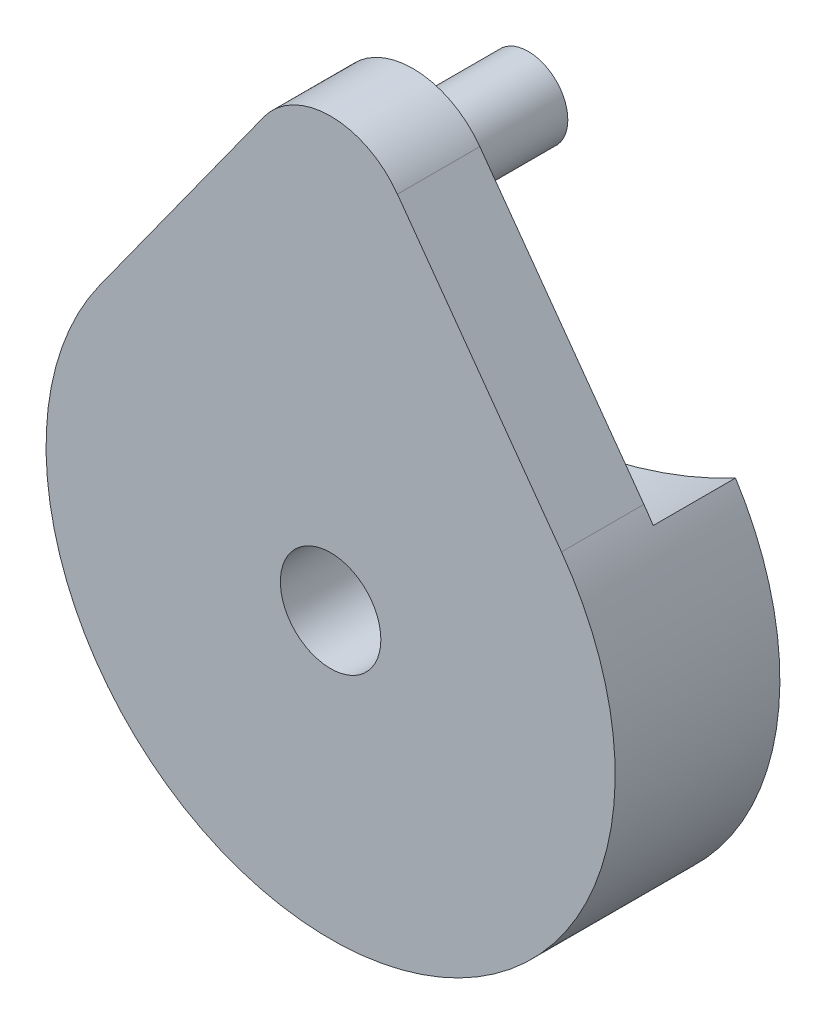
ISO-10303-21;
HEADER;
FILE_DESCRIPTION(('STEP AP214'),'2;1');
FILE_NAME('part.step','',(''),(''),'','','');
FILE_SCHEMA(('AUTOMOTIVE_DESIGN { 1 0 10303 214 1 1 1 1 }'));
ENDSEC;
DATA;
#1=APPLICATION_CONTEXT('core data for automotive mechanical design processes');
#2=APPLICATION_PROTOCOL_DEFINITION('international standard','automotive_design',2000,#1);
#3=PRODUCT_CONTEXT('',#1,'mechanical');
#4=PRODUCT('Part','Part','',(#3));
#5=PRODUCT_RELATED_PRODUCT_CATEGORY('part','',(#4));
#6=PRODUCT_DEFINITION_FORMATION('','',#4);
#7=PRODUCT_DEFINITION_CONTEXT('part definition',#1,'design');
#8=PRODUCT_DEFINITION('design','',#6,#7);
#9=PRODUCT_DEFINITION_SHAPE('','',#8);
#10=(LENGTH_UNIT() NAMED_UNIT(*) SI_UNIT(.MILLI.,.METRE.));
#11=(NAMED_UNIT(*) PLANE_ANGLE_UNIT() SI_UNIT($,.RADIAN.));
#12=(NAMED_UNIT(*) SI_UNIT($,.STERADIAN.) SOLID_ANGLE_UNIT());
#13=UNCERTAINTY_MEASURE_WITH_UNIT(LENGTH_MEASURE(1.E-05),#10,'distance_accuracy_value','');
#14=(GEOMETRIC_REPRESENTATION_CONTEXT(3) GLOBAL_UNCERTAINTY_ASSIGNED_CONTEXT((#13)) GLOBAL_UNIT_ASSIGNED_CONTEXT((#10,
#11,#12)) REPRESENTATION_CONTEXT('',''));
#15=CARTESIAN_POINT('',(0.,0.,0.));
#16=DIRECTION('',(0.,0.,1.));
#17=DIRECTION('',(1.,0.,0.));
#18=AXIS2_PLACEMENT_3D('',#15,#16,#17);
#19=CARTESIAN_POINT('',(0.,-36.6196668472011,-2.5));
#20=DIRECTION('',(0.,0.,1.));
#21=DIRECTION('',(1.,0.,0.));
#22=AXIS2_PLACEMENT_3D('',#19,#20,#21);
#23=PLANE('',#22);
#24=CARTESIAN_POINT('',(0.,-15.6196668472011,-2.5));
#25=DIRECTION('',(0.,0.,1.));
#26=DIRECTION('',(1.,0.,0.));
#27=AXIS2_PLACEMENT_3D('',#24,#25,#26);
#28=CIRCLE('',#27,2.4);
#29=CARTESIAN_POINT('',(2.4,-15.6196668472011,-2.5));
#30=VERTEX_POINT('',#29);
#31=EDGE_CURVE('E11',#30,#30,#28,.F.);
#32=ORIENTED_EDGE('',*,*,#31,.F.);
#33=EDGE_LOOP('',(#32));
#34=FACE_BOUND('',#33,.T.);
#35=CARTESIAN_POINT('',(0.,0.,-2.5));
#36=DIRECTION('',(0.,0.,1.));
#37=DIRECTION('',(-1.,0.,0.));
#38=AXIS2_PLACEMENT_3D('',#35,#36,#37);
#39=CIRCLE('',#38,31.);
#40=CARTESIAN_POINT('',(-14.5799521902476,-27.357357221232,-2.5));
#41=VERTEX_POINT('',#40);
#42=CARTESIAN_POINT('',(14.5799521902476,-27.357357221232,-2.5));
#43=VERTEX_POINT('',#42);
#44=EDGE_CURVE('E49',#41,#43,#39,.T.);
#45=ORIENTED_EDGE('',*,*,#44,.F.);
#46=CARTESIAN_POINT('',(0.,-36.6196668472011,-2.5));
#47=DIRECTION('',(0.,0.,1.));
#48=DIRECTION('',(1.,0.,0.));
#49=AXIS2_PLACEMENT_3D('',#46,#47,#48);
#50=CIRCLE('',#49,17.2732563657588);
#51=CARTESIAN_POINT('',(-14.0161483680143,-26.5244714353709,-2.5));
#52=VERTEX_POINT('',#51);
#53=EDGE_CURVE('E114',#52,#41,#50,.T.);
#54=ORIENTED_EDGE('',*,*,#53,.F.);
#55=DIRECTION('',(-0.584440779321849,-0.811436365629289,0.));
#56=VECTOR('',#55,1.);
#57=CARTESIAN_POINT('',(-14.0161483680143,-26.5244714353709,-2.5));
#58=LINE('',#57,#56);
#59=CARTESIAN_POINT('',(-4.05718182814645,-12.6974629505919,-2.5));
#60=VERTEX_POINT('',#59);
#61=EDGE_CURVE('E79',#60,#52,#58,.T.);
#62=ORIENTED_EDGE('',*,*,#61,.F.);
#63=CARTESIAN_POINT('',(0.,-15.6196668472011,-2.5));
#64=DIRECTION('',(0.,0.,1.));
#65=DIRECTION('',(1.,0.,0.));
#66=AXIS2_PLACEMENT_3D('',#63,#64,#65);
#67=CIRCLE('',#66,5.);
#68=CARTESIAN_POINT('',(4.05718182814645,-12.6974629505919,-2.5));
#69=VERTEX_POINT('',#68);
#70=EDGE_CURVE('E146',#69,#60,#67,.T.);
#71=ORIENTED_EDGE('',*,*,#70,.F.);
#72=DIRECTION('',(-0.584440779321849,0.81143636562929,0.));
#73=VECTOR('',#72,1.);
#74=CARTESIAN_POINT('',(14.0161483680143,-26.5244714353709,-2.5));
#75=LINE('',#74,#73);
#76=CARTESIAN_POINT('',(14.0161483680143,-26.5244714353709,-2.5));
#77=VERTEX_POINT('',#76);
#78=EDGE_CURVE('E135',#77,#69,#75,.T.);
#79=ORIENTED_EDGE('',*,*,#78,.F.);
#80=EDGE_CURVE('E112',#43,#77,#50,.T.);
#81=ORIENTED_EDGE('',*,*,#80,.F.);
#82=EDGE_LOOP('',(#45,#54,#62,#71,#79,#81));
#83=FACE_BOUND('',#82,.T.);
#84=ADVANCED_FACE('F34',(#34,#83),#23,.F.);
#85=CARTESIAN_POINT('',(0.,-36.6196668472011,2.5));
#86=DIRECTION('',(0.,0.,-1.));
#87=DIRECTION('',(-1.,0.,0.));
#88=AXIS2_PLACEMENT_3D('',#85,#86,#87);
#89=CYLINDRICAL_SURFACE('',#88,17.2732563657588);
#90=ORIENTED_EDGE('',*,*,#53,.T.);
#91=DIRECTION('',(0.,0.,1.));
#92=VECTOR('',#91,1.);
#93=CARTESIAN_POINT('',(-14.5799521902476,-27.357357221232,-7.5));
#94=LINE('',#93,#92);
#95=CARTESIAN_POINT('',(-14.5799521902476,-27.357357221232,-7.5));
#96=VERTEX_POINT('',#95);
#97=EDGE_CURVE('E103',#96,#41,#94,.T.);
#98=ORIENTED_EDGE('',*,*,#97,.F.);
#99=CARTESIAN_POINT('',(0.,-36.6196668472011,-7.5));
#100=DIRECTION('',(0.,0.,-1.));
#101=DIRECTION('',(-1.,0.,0.));
#102=AXIS2_PLACEMENT_3D('',#99,#100,#101);
#103=CIRCLE('',#102,17.2732563657588);
#104=CARTESIAN_POINT('',(14.5799521902476,-27.357357221232,-7.5));
#105=VERTEX_POINT('',#104);
#106=EDGE_CURVE('E98',#105,#96,#103,.T.);
#107=ORIENTED_EDGE('',*,*,#106,.F.);
#108=DIRECTION('',(0.,0.,1.));
#109=VECTOR('',#108,1.);
#110=CARTESIAN_POINT('',(14.5799521902476,-27.357357221232,-7.5));
#111=LINE('',#110,#109);
#112=EDGE_CURVE('E101',#105,#43,#111,.T.);
#113=ORIENTED_EDGE('',*,*,#112,.T.);
#114=ORIENTED_EDGE('',*,*,#80,.T.);
#115=DIRECTION('',(0.,0.,-1.));
#116=VECTOR('',#115,1.);
#117=CARTESIAN_POINT('',(14.0161483680143,-26.5244714353709,2.5));
#118=LINE('',#117,#116);
#119=CARTESIAN_POINT('',(14.0161483680143,-26.5244714353709,2.5));
#120=VERTEX_POINT('',#119);
#121=EDGE_CURVE('E42',#120,#77,#118,.T.);
#122=ORIENTED_EDGE('',*,*,#121,.F.);
#123=CARTESIAN_POINT('',(0.,-36.6196668472011,2.5));
#124=DIRECTION('',(0.,0.,1.));
#125=DIRECTION('',(1.,0.,0.));
#126=AXIS2_PLACEMENT_3D('',#123,#124,#125);
#127=CIRCLE('',#126,17.2732563657588);
#128=CARTESIAN_POINT('',(-14.0161483680143,-26.5244714353709,2.5));
#129=VERTEX_POINT('',#128);
#130=EDGE_CURVE('E127',#129,#120,#127,.T.);
#131=ORIENTED_EDGE('',*,*,#130,.F.);
#132=DIRECTION('',(0.,0.,-1.));
#133=VECTOR('',#132,1.);
#134=CARTESIAN_POINT('',(-14.0161483680143,-26.5244714353709,2.5));
#135=LINE('',#134,#133);
#136=EDGE_CURVE('E132',#129,#52,#135,.T.);
#137=ORIENTED_EDGE('',*,*,#136,.T.);
#138=EDGE_LOOP('',(#90,#98,#107,#113,#114,#122,#131,#137));
#139=FACE_BOUND('',#138,.T.);
#140=ADVANCED_FACE('F36',(#139),#89,.T.);
#141=CARTESIAN_POINT('',(14.0161483680143,-26.5244714353709,2.5));
#142=DIRECTION('',(-0.81143636562929,-0.584440779321849,0.));
#143=DIRECTION('',(0.584440779321849,-0.81143636562929,0.));
#144=AXIS2_PLACEMENT_3D('',#141,#142,#143);
#145=PLANE('',#144);
#146=ORIENTED_EDGE('',*,*,#78,.T.);
#147=DIRECTION('',(0.,0.,-1.));
#148=VECTOR('',#147,1.);
#149=CARTESIAN_POINT('',(4.05718182814645,-12.6974629505919,2.5));
#150=LINE('',#149,#148);
#151=CARTESIAN_POINT('',(4.05718182814645,-12.6974629505919,2.5));
#152=VERTEX_POINT('',#151);
#153=EDGE_CURVE('E140',#152,#69,#150,.T.);
#154=ORIENTED_EDGE('',*,*,#153,.F.);
#155=DIRECTION('',(-0.584440779321849,0.81143636562929,0.));
#156=VECTOR('',#155,1.);
#157=CARTESIAN_POINT('',(14.0161483680143,-26.5244714353709,2.5));
#158=LINE('',#157,#156);
#159=EDGE_CURVE('E87',#120,#152,#158,.T.);
#160=ORIENTED_EDGE('',*,*,#159,.F.);
#161=ORIENTED_EDGE('',*,*,#121,.T.);
#162=EDGE_LOOP('',(#146,#154,#160,#161));
#163=FACE_BOUND('',#162,.T.);
#164=ADVANCED_FACE('F151',(#163),#145,.F.);
#165=CARTESIAN_POINT('',(0.,-15.6196668472011,2.5));
#166=DIRECTION('',(0.,0.,-1.));
#167=DIRECTION('',(-1.,0.,0.));
#168=AXIS2_PLACEMENT_3D('',#165,#166,#167);
#169=CYLINDRICAL_SURFACE('',#168,5.);
#170=ORIENTED_EDGE('',*,*,#70,.T.);
#171=DIRECTION('',(0.,0.,-1.));
#172=VECTOR('',#171,1.);
#173=CARTESIAN_POINT('',(-4.05718182814645,-12.6974629505919,2.5));
#174=LINE('',#173,#172);
#175=CARTESIAN_POINT('',(-4.05718182814645,-12.6974629505919,2.5));
#176=VERTEX_POINT('',#175);
#177=EDGE_CURVE('E143',#176,#60,#174,.T.);
#178=ORIENTED_EDGE('',*,*,#177,.F.);
#179=CARTESIAN_POINT('',(0.,-15.6196668472011,2.5));
#180=DIRECTION('',(0.,0.,1.));
#181=DIRECTION('',(1.,0.,0.));
#182=AXIS2_PLACEMENT_3D('',#179,#180,#181);
#183=CIRCLE('',#182,5.);
#184=EDGE_CURVE('E130',#152,#176,#183,.T.);
#185=ORIENTED_EDGE('',*,*,#184,.F.);
#186=ORIENTED_EDGE('',*,*,#153,.T.);
#187=EDGE_LOOP('',(#170,#178,#185,#186));
#188=FACE_BOUND('',#187,.T.);
#189=ADVANCED_FACE('F154',(#188),#169,.T.);
#190=CARTESIAN_POINT('',(-14.0161483680143,-26.5244714353709,2.5));
#191=DIRECTION('',(0.81143636562929,-0.584440779321849,0.));
#192=DIRECTION('',(0.584440779321849,0.81143636562929,0.));
#193=AXIS2_PLACEMENT_3D('',#190,#191,#192);
#194=PLANE('',#193);
#195=ORIENTED_EDGE('',*,*,#61,.T.);
#196=ORIENTED_EDGE('',*,*,#136,.F.);
#197=DIRECTION('',(-0.584440779321849,-0.811436365629289,0.));
#198=VECTOR('',#197,1.);
#199=CARTESIAN_POINT('',(-14.0161483680143,-26.5244714353709,2.5));
#200=LINE('',#199,#198);
#201=EDGE_CURVE('E58',#176,#129,#200,.T.);
#202=ORIENTED_EDGE('',*,*,#201,.F.);
#203=ORIENTED_EDGE('',*,*,#177,.T.);
#204=EDGE_LOOP('',(#195,#196,#202,#203));
#205=FACE_BOUND('',#204,.T.);
#206=ADVANCED_FACE('F156',(#205),#194,.F.);
#207=CARTESIAN_POINT('',(0.,-36.6196668472011,2.5));
#208=DIRECTION('',(0.,0.,1.));
#209=DIRECTION('',(1.,0.,0.));
#210=AXIS2_PLACEMENT_3D('',#207,#208,#209);
#211=PLANE('',#210);
#212=CARTESIAN_POINT('',(0.,-36.6196668472011,2.5));
#213=DIRECTION('',(0.,0.,1.));
#214=DIRECTION('',(1.,0.,0.));
#215=AXIS2_PLACEMENT_3D('',#212,#213,#214);
#216=CIRCLE('',#215,3.04999999999999);
#217=CARTESIAN_POINT('',(3.04999999999999,-36.6196668472011,2.5));
#218=VERTEX_POINT('',#217);
#219=EDGE_CURVE('E196',#218,#218,#216,.T.);
#220=ORIENTED_EDGE('',*,*,#219,.F.);
#221=EDGE_LOOP('',(#220));
#222=FACE_BOUND('',#221,.T.);
#223=ORIENTED_EDGE('',*,*,#130,.T.);
#224=ORIENTED_EDGE('',*,*,#159,.T.);
#225=ORIENTED_EDGE('',*,*,#184,.T.);
#226=ORIENTED_EDGE('',*,*,#201,.T.);
#227=EDGE_LOOP('',(#223,#224,#225,#226));
#228=FACE_BOUND('',#227,.T.);
#229=ADVANCED_FACE('F158',(#222,#228),#211,.T.);
#230=CARTESIAN_POINT('',(0.,0.,-7.5));
#231=DIRECTION('',(0.,0.,1.));
#232=DIRECTION('',(1.,0.,0.));
#233=AXIS2_PLACEMENT_3D('',#230,#231,#232);
#234=CYLINDRICAL_SURFACE('',#233,31.);
#235=ORIENTED_EDGE('',*,*,#44,.T.);
#236=ORIENTED_EDGE('',*,*,#112,.F.);
#237=CARTESIAN_POINT('',(0.,0.,-7.5));
#238=DIRECTION('',(0.,0.,1.));
#239=DIRECTION('',(-1.,0.,0.));
#240=AXIS2_PLACEMENT_3D('',#237,#238,#239);
#241=CIRCLE('',#240,31.);
#242=EDGE_CURVE('E106',#96,#105,#241,.T.);
#243=ORIENTED_EDGE('',*,*,#242,.F.);
#244=ORIENTED_EDGE('',*,*,#97,.T.);
#245=EDGE_LOOP('',(#235,#236,#243,#244));
#246=FACE_BOUND('',#245,.T.);
#247=ADVANCED_FACE('F111',(#246),#234,.F.);
#248=CARTESIAN_POINT('',(0.,-18.3098334236006,-7.5));
#249=DIRECTION('',(0.,0.,-1.));
#250=DIRECTION('',(-1.,0.,0.));
#251=AXIS2_PLACEMENT_3D('',#248,#249,#250);
#252=PLANE('',#251);
#253=CARTESIAN_POINT('',(0.,-36.6196668472011,-7.5));
#254=DIRECTION('',(0.,0.,-1.));
#255=DIRECTION('',(-1.,0.,0.));
#256=AXIS2_PLACEMENT_3D('',#253,#254,#255);
#257=CIRCLE('',#256,3.04999999999999);
#258=CARTESIAN_POINT('',(-3.04999999999999,-36.6196668472011,-7.5));
#259=VERTEX_POINT('',#258);
#260=EDGE_CURVE('E123',#259,#259,#257,.T.);
#261=ORIENTED_EDGE('',*,*,#260,.F.);
#262=EDGE_LOOP('',(#261));
#263=FACE_BOUND('',#262,.T.);
#264=ORIENTED_EDGE('',*,*,#242,.T.);
#265=ORIENTED_EDGE('',*,*,#106,.T.);
#266=EDGE_LOOP('',(#264,#265));
#267=FACE_BOUND('',#266,.T.);
#268=ADVANCED_FACE('F108',(#263,#267),#252,.T.);
#269=CARTESIAN_POINT('',(0.,-36.6196668472011,-7.500025));
#270=DIRECTION('',(0.,0.,1.));
#271=DIRECTION('',(1.,0.,0.));
#272=AXIS2_PLACEMENT_3D('',#269,#270,#271);
#273=CYLINDRICAL_SURFACE('',#272,3.04999999999999);
#274=ORIENTED_EDGE('',*,*,#260,.T.);
#275=EDGE_LOOP('',(#274));
#276=FACE_BOUND('',#275,.T.);
#277=ORIENTED_EDGE('',*,*,#219,.T.);
#278=EDGE_LOOP('',(#277));
#279=FACE_BOUND('',#278,.T.);
#280=ADVANCED_FACE('F179',(#276,#279),#273,.F.);
#281=CARTESIAN_POINT('',(0.,-15.6196668472011,-9.5));
#282=DIRECTION('',(0.,0.,1.));
#283=DIRECTION('',(1.,0.,0.));
#284=AXIS2_PLACEMENT_3D('',#281,#282,#283);
#285=CYLINDRICAL_SURFACE('',#284,2.4);
#286=CARTESIAN_POINT('',(0.,-15.6196668472011,-9.5));
#287=DIRECTION('',(0.,0.,-1.));
#288=DIRECTION('',(-1.,0.,0.));
#289=AXIS2_PLACEMENT_3D('',#286,#287,#288);
#290=CIRCLE('',#289,2.4);
#291=CARTESIAN_POINT('',(-2.4,-15.6196668472011,-9.5));
#292=VERTEX_POINT('',#291);
#293=EDGE_CURVE('E195',#292,#292,#290,.T.);
#294=ORIENTED_EDGE('',*,*,#293,.F.);
#295=EDGE_LOOP('',(#294));
#296=FACE_BOUND('',#295,.T.);
#297=ORIENTED_EDGE('',*,*,#31,.T.);
#298=EDGE_LOOP('',(#297));
#299=FACE_BOUND('',#298,.T.);
#300=ADVANCED_FACE('F183',(#296,#299),#285,.T.);
#301=CARTESIAN_POINT('',(0.,-15.6196668472011,-9.5));
#302=DIRECTION('',(0.,0.,-1.));
#303=DIRECTION('',(-1.,0.,0.));
#304=AXIS2_PLACEMENT_3D('',#301,#302,#303);
#305=PLANE('',#304);
#306=ORIENTED_EDGE('',*,*,#293,.T.);
#307=EDGE_LOOP('',(#306));
#308=FACE_BOUND('',#307,.T.);
#309=ADVANCED_FACE('F187',(#308),#305,.T.);
#310=CLOSED_SHELL('',(#84,#140,#164,#189,#206,#229,#247,#268,#280,#300,#309));
#311=MANIFOLD_SOLID_BREP('B2',#310);
#312=ADVANCED_BREP_SHAPE_REPRESENTATION('',(#18,#311),#14);
#313=SHAPE_DEFINITION_REPRESENTATION(#9,#312);
ENDSEC;
END-ISO-10303-21;
